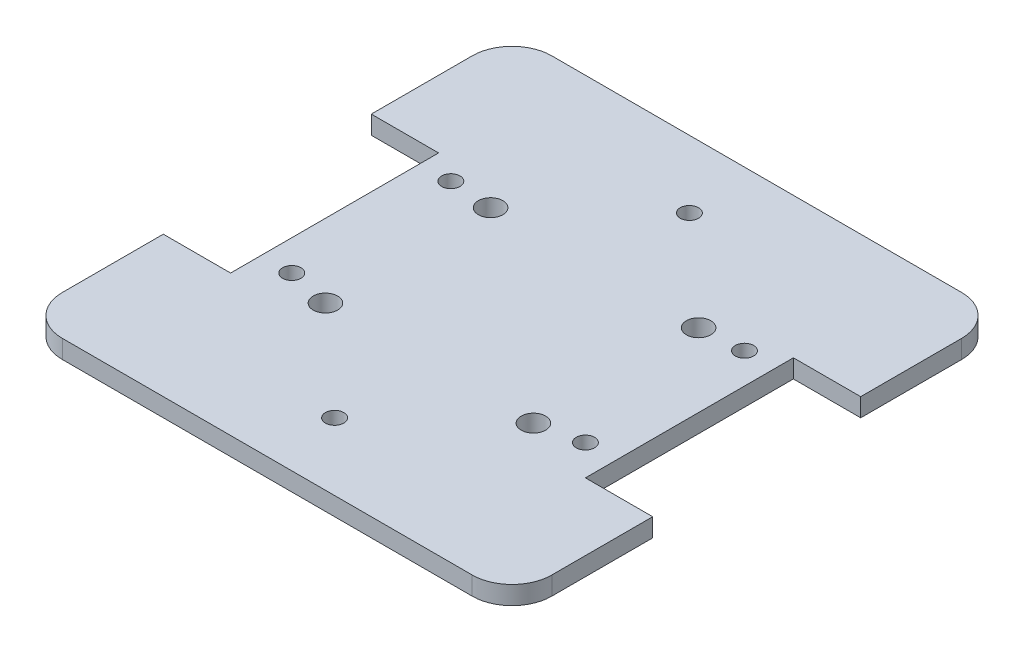
ISO-10303-21;
HEADER;
FILE_DESCRIPTION(('STEP AP214'),'2;1');
FILE_NAME('part.step','',(''),(''),'','','');
FILE_SCHEMA(('AUTOMOTIVE_DESIGN { 1 0 10303 214 1 1 1 1 }'));
ENDSEC;
DATA;
#1=APPLICATION_CONTEXT('core data for automotive mechanical design processes');
#2=APPLICATION_PROTOCOL_DEFINITION('international standard','automotive_design',2000,#1);
#3=PRODUCT_CONTEXT('',#1,'mechanical');
#4=PRODUCT('Part','Part','',(#3));
#5=PRODUCT_RELATED_PRODUCT_CATEGORY('part','',(#4));
#6=PRODUCT_DEFINITION_FORMATION('','',#4);
#7=PRODUCT_DEFINITION_CONTEXT('part definition',#1,'design');
#8=PRODUCT_DEFINITION('design','',#6,#7);
#9=PRODUCT_DEFINITION_SHAPE('','',#8);
#10=(LENGTH_UNIT() NAMED_UNIT(*) SI_UNIT(.MILLI.,.METRE.));
#11=(NAMED_UNIT(*) PLANE_ANGLE_UNIT() SI_UNIT($,.RADIAN.));
#12=(NAMED_UNIT(*) SI_UNIT($,.STERADIAN.) SOLID_ANGLE_UNIT());
#13=UNCERTAINTY_MEASURE_WITH_UNIT(LENGTH_MEASURE(1.E-05),#10,'distance_accuracy_value','');
#14=(GEOMETRIC_REPRESENTATION_CONTEXT(3) GLOBAL_UNCERTAINTY_ASSIGNED_CONTEXT((#13)) GLOBAL_UNIT_ASSIGNED_CONTEXT((#10,
#11,#12)) REPRESENTATION_CONTEXT('',''));
#15=CARTESIAN_POINT('',(0.,0.,0.));
#16=DIRECTION('',(0.,0.,1.));
#17=DIRECTION('',(1.,0.,0.));
#18=AXIS2_PLACEMENT_3D('',#15,#16,#17);
#19=CARTESIAN_POINT('',(6.5,3.,-6.5));
#20=DIRECTION('',(0.,-1.,0.));
#21=DIRECTION('',(0.,0.,-1.));
#22=AXIS2_PLACEMENT_3D('',#19,#20,#21);
#23=PLANE('',#22);
#24=CARTESIAN_POINT('',(6.5,3.,-6.5));
#25=DIRECTION('',(0.,1.,0.));
#26=DIRECTION('',(0.,0.,-1.));
#27=AXIS2_PLACEMENT_3D('',#24,#25,#26);
#28=CIRCLE('',#27,6.5);
#29=CARTESIAN_POINT('',(0.,3.,-6.50000000000005));
#30=VERTEX_POINT('',#29);
#31=CARTESIAN_POINT('',(6.50000000000005,3.,0.));
#32=VERTEX_POINT('',#31);
#33=EDGE_CURVE('E214',#30,#32,#28,.T.);
#34=ORIENTED_EDGE('',*,*,#33,.T.);
#35=DIRECTION('',(1.,0.,0.));
#36=VECTOR('',#35,1.);
#37=CARTESIAN_POINT('',(6.50000000000005,3.,0.));
#38=LINE('',#37,#36);
#39=CARTESIAN_POINT('',(73.5,3.,0.));
#40=VERTEX_POINT('',#39);
#41=EDGE_CURVE('E122',#32,#40,#38,.T.);
#42=ORIENTED_EDGE('',*,*,#41,.T.);
#43=CARTESIAN_POINT('',(73.5,3.,-6.5));
#44=DIRECTION('',(0.,1.,0.));
#45=DIRECTION('',(0.,0.,-1.));
#46=AXIS2_PLACEMENT_3D('',#43,#44,#45);
#47=CIRCLE('',#46,6.5);
#48=CARTESIAN_POINT('',(80.,3.,-6.50000000000005));
#49=VERTEX_POINT('',#48);
#50=EDGE_CURVE('E253',#40,#49,#47,.T.);
#51=ORIENTED_EDGE('',*,*,#50,.T.);
#52=DIRECTION('',(0.,0.,-1.));
#53=VECTOR('',#52,1.);
#54=CARTESIAN_POINT('',(80.,3.,-6.50000000000005));
#55=LINE('',#54,#53);
#56=CARTESIAN_POINT('',(80.,3.,-23.));
#57=VERTEX_POINT('',#56);
#58=EDGE_CURVE('E272',#49,#57,#55,.T.);
#59=ORIENTED_EDGE('',*,*,#58,.T.);
#60=DIRECTION('',(-1.,0.,0.));
#61=VECTOR('',#60,1.);
#62=CARTESIAN_POINT('',(69.,3.,-23.));
#63=LINE('',#62,#61);
#64=CARTESIAN_POINT('',(69.,3.,-23.));
#65=VERTEX_POINT('',#64);
#66=EDGE_CURVE('E269',#57,#65,#63,.T.);
#67=ORIENTED_EDGE('',*,*,#66,.T.);
#68=DIRECTION('',(0.,0.,-1.));
#69=VECTOR('',#68,1.);
#70=CARTESIAN_POINT('',(69.,3.,-23.));
#71=LINE('',#70,#69);
#72=CARTESIAN_POINT('',(69.,3.,-57.));
#73=VERTEX_POINT('',#72);
#74=EDGE_CURVE('E271',#65,#73,#71,.T.);
#75=ORIENTED_EDGE('',*,*,#74,.T.);
#76=DIRECTION('',(1.,0.,0.));
#77=VECTOR('',#76,1.);
#78=CARTESIAN_POINT('',(69.,3.,-57.));
#79=LINE('',#78,#77);
#80=CARTESIAN_POINT('',(80.,3.,-57.));
#81=VERTEX_POINT('',#80);
#82=EDGE_CURVE('E274',#73,#81,#79,.T.);
#83=ORIENTED_EDGE('',*,*,#82,.T.);
#84=DIRECTION('',(0.,0.,-1.));
#85=VECTOR('',#84,1.);
#86=CARTESIAN_POINT('',(80.,3.,-57.));
#87=LINE('',#86,#85);
#88=CARTESIAN_POINT('',(80.,3.,-73.5));
#89=VERTEX_POINT('',#88);
#90=EDGE_CURVE('E280',#81,#89,#87,.T.);
#91=ORIENTED_EDGE('',*,*,#90,.T.);
#92=CARTESIAN_POINT('',(73.5,3.,-73.5));
#93=DIRECTION('',(0.,1.,0.));
#94=DIRECTION('',(0.,0.,-1.));
#95=AXIS2_PLACEMENT_3D('',#92,#93,#94);
#96=CIRCLE('',#95,6.5);
#97=CARTESIAN_POINT('',(73.5,3.,-80.));
#98=VERTEX_POINT('',#97);
#99=EDGE_CURVE('E282',#89,#98,#96,.T.);
#100=ORIENTED_EDGE('',*,*,#99,.T.);
#101=DIRECTION('',(-1.,0.,0.));
#102=VECTOR('',#101,1.);
#103=CARTESIAN_POINT('',(73.5,3.,-80.));
#104=LINE('',#103,#102);
#105=CARTESIAN_POINT('',(6.50000000000005,3.,-80.));
#106=VERTEX_POINT('',#105);
#107=EDGE_CURVE('E284',#98,#106,#104,.T.);
#108=ORIENTED_EDGE('',*,*,#107,.T.);
#109=CARTESIAN_POINT('',(6.50000000000001,3.,-73.5));
#110=DIRECTION('',(0.,1.,0.));
#111=DIRECTION('',(0.,0.,1.));
#112=AXIS2_PLACEMENT_3D('',#109,#110,#111);
#113=CIRCLE('',#112,6.5);
#114=CARTESIAN_POINT('',(0.,3.,-73.4999999999999));
#115=VERTEX_POINT('',#114);
#116=EDGE_CURVE('E286',#106,#115,#113,.T.);
#117=ORIENTED_EDGE('',*,*,#116,.T.);
#118=DIRECTION('',(0.,0.,1.));
#119=VECTOR('',#118,1.);
#120=CARTESIAN_POINT('',(0.,3.,-73.4999999999999));
#121=LINE('',#120,#119);
#122=CARTESIAN_POINT('',(0.,3.,-57.));
#123=VERTEX_POINT('',#122);
#124=EDGE_CURVE('E288',#115,#123,#121,.T.);
#125=ORIENTED_EDGE('',*,*,#124,.T.);
#126=DIRECTION('',(1.,0.,0.));
#127=VECTOR('',#126,1.);
#128=CARTESIAN_POINT('',(11.,3.,-57.));
#129=LINE('',#128,#127);
#130=CARTESIAN_POINT('',(11.,3.,-57.));
#131=VERTEX_POINT('',#130);
#132=EDGE_CURVE('E165',#123,#131,#129,.T.);
#133=ORIENTED_EDGE('',*,*,#132,.T.);
#134=DIRECTION('',(0.,0.,1.));
#135=VECTOR('',#134,1.);
#136=CARTESIAN_POINT('',(11.,3.,-23.));
#137=LINE('',#136,#135);
#138=CARTESIAN_POINT('',(11.,3.,-23.));
#139=VERTEX_POINT('',#138);
#140=EDGE_CURVE('E159',#131,#139,#137,.T.);
#141=ORIENTED_EDGE('',*,*,#140,.T.);
#142=DIRECTION('',(-1.,0.,0.));
#143=VECTOR('',#142,1.);
#144=CARTESIAN_POINT('',(11.,3.,-23.));
#145=LINE('',#144,#143);
#146=CARTESIAN_POINT('',(0.,3.,-23.));
#147=VERTEX_POINT('',#146);
#148=EDGE_CURVE('E163',#139,#147,#145,.T.);
#149=ORIENTED_EDGE('',*,*,#148,.T.);
#150=DIRECTION('',(0.,0.,1.));
#151=VECTOR('',#150,1.);
#152=CARTESIAN_POINT('',(0.,3.,-23.));
#153=LINE('',#152,#151);
#154=EDGE_CURVE('E55',#147,#30,#153,.T.);
#155=ORIENTED_EDGE('',*,*,#154,.T.);
#156=EDGE_LOOP('',(#34,#42,#51,#59,#67,#75,#83,#91,#100,#108,#117,#125,#133,#141,#149,#155));
#157=FACE_BOUND('',#156,.T.);
#158=CARTESIAN_POINT('',(23.,3.,-53.5));
#159=DIRECTION('',(0.,1.,0.));
#160=DIRECTION('',(0.,0.,1.));
#161=AXIS2_PLACEMENT_3D('',#158,#159,#160);
#162=CIRCLE('',#161,2.);
#163=CARTESIAN_POINT('',(23.,3.,-51.5));
#164=VERTEX_POINT('',#163);
#165=EDGE_CURVE('E187',#164,#164,#162,.T.);
#166=ORIENTED_EDGE('',*,*,#165,.F.);
#167=EDGE_LOOP('',(#166));
#168=FACE_BOUND('',#167,.T.);
#169=CARTESIAN_POINT('',(23.,3.,-26.5));
#170=DIRECTION('',(0.,1.,0.));
#171=DIRECTION('',(0.,0.,1.));
#172=AXIS2_PLACEMENT_3D('',#169,#170,#171);
#173=CIRCLE('',#172,2.);
#174=CARTESIAN_POINT('',(23.,3.,-24.5));
#175=VERTEX_POINT('',#174);
#176=EDGE_CURVE('E412',#175,#175,#173,.T.);
#177=ORIENTED_EDGE('',*,*,#176,.F.);
#178=EDGE_LOOP('',(#177));
#179=FACE_BOUND('',#178,.T.);
#180=CARTESIAN_POINT('',(57.,3.,-26.5));
#181=DIRECTION('',(0.,1.,0.));
#182=DIRECTION('',(0.,0.,-1.));
#183=AXIS2_PLACEMENT_3D('',#180,#181,#182);
#184=CIRCLE('',#183,2.);
#185=CARTESIAN_POINT('',(57.,3.,-28.5));
#186=VERTEX_POINT('',#185);
#187=EDGE_CURVE('E406',#186,#186,#184,.T.);
#188=ORIENTED_EDGE('',*,*,#187,.F.);
#189=EDGE_LOOP('',(#188));
#190=FACE_BOUND('',#189,.T.);
#191=CARTESIAN_POINT('',(57.,3.,-53.5));
#192=DIRECTION('',(0.,1.,0.));
#193=DIRECTION('',(0.,0.,-1.));
#194=AXIS2_PLACEMENT_3D('',#191,#192,#193);
#195=CIRCLE('',#194,2.);
#196=CARTESIAN_POINT('',(57.,3.,-55.5));
#197=VERTEX_POINT('',#196);
#198=EDGE_CURVE('E400',#197,#197,#195,.T.);
#199=ORIENTED_EDGE('',*,*,#198,.F.);
#200=EDGE_LOOP('',(#199));
#201=FACE_BOUND('',#200,.T.);
#202=CARTESIAN_POINT('',(40.,3.,-69.));
#203=DIRECTION('',(0.,1.,0.));
#204=DIRECTION('',(0.,0.,1.));
#205=AXIS2_PLACEMENT_3D('',#202,#203,#204);
#206=CIRCLE('',#205,1.5);
#207=CARTESIAN_POINT('',(40.,3.,-67.5));
#208=VERTEX_POINT('',#207);
#209=EDGE_CURVE('E394',#208,#208,#206,.T.);
#210=ORIENTED_EDGE('',*,*,#209,.F.);
#211=EDGE_LOOP('',(#210));
#212=FACE_BOUND('',#211,.T.);
#213=CARTESIAN_POINT('',(40.,3.,-11.));
#214=DIRECTION('',(0.,1.,0.));
#215=DIRECTION('',(0.,0.,-1.));
#216=AXIS2_PLACEMENT_3D('',#213,#214,#215);
#217=CIRCLE('',#216,1.5);
#218=CARTESIAN_POINT('',(40.,3.,-12.5));
#219=VERTEX_POINT('',#218);
#220=EDGE_CURVE('E388',#219,#219,#217,.T.);
#221=ORIENTED_EDGE('',*,*,#220,.F.);
#222=EDGE_LOOP('',(#221));
#223=FACE_BOUND('',#222,.T.);
#224=CARTESIAN_POINT('',(16.,3.,-54.));
#225=DIRECTION('',(0.,1.,0.));
#226=DIRECTION('',(0.,0.,1.));
#227=AXIS2_PLACEMENT_3D('',#224,#225,#226);
#228=CIRCLE('',#227,1.5);
#229=CARTESIAN_POINT('',(16.,3.,-52.5));
#230=VERTEX_POINT('',#229);
#231=EDGE_CURVE('E382',#230,#230,#228,.T.);
#232=ORIENTED_EDGE('',*,*,#231,.F.);
#233=EDGE_LOOP('',(#232));
#234=FACE_BOUND('',#233,.T.);
#235=CARTESIAN_POINT('',(16.,3.,-28.));
#236=DIRECTION('',(0.,1.,0.));
#237=DIRECTION('',(0.,0.,1.));
#238=AXIS2_PLACEMENT_3D('',#235,#236,#237);
#239=CIRCLE('',#238,1.5);
#240=CARTESIAN_POINT('',(16.,3.,-26.5));
#241=VERTEX_POINT('',#240);
#242=EDGE_CURVE('E376',#241,#241,#239,.T.);
#243=ORIENTED_EDGE('',*,*,#242,.F.);
#244=EDGE_LOOP('',(#243));
#245=FACE_BOUND('',#244,.T.);
#246=CARTESIAN_POINT('',(64.,3.,-28.));
#247=DIRECTION('',(0.,1.,0.));
#248=DIRECTION('',(0.,0.,-1.));
#249=AXIS2_PLACEMENT_3D('',#246,#247,#248);
#250=CIRCLE('',#249,1.50000000000001);
#251=CARTESIAN_POINT('',(64.,3.,-29.5));
#252=VERTEX_POINT('',#251);
#253=EDGE_CURVE('E370',#252,#252,#250,.T.);
#254=ORIENTED_EDGE('',*,*,#253,.F.);
#255=EDGE_LOOP('',(#254));
#256=FACE_BOUND('',#255,.T.);
#257=CARTESIAN_POINT('',(64.,3.,-54.));
#258=DIRECTION('',(0.,1.,0.));
#259=DIRECTION('',(0.,0.,-1.));
#260=AXIS2_PLACEMENT_3D('',#257,#258,#259);
#261=CIRCLE('',#260,1.5);
#262=CARTESIAN_POINT('',(64.,3.,-55.5));
#263=VERTEX_POINT('',#262);
#264=EDGE_CURVE('E361',#263,#263,#261,.T.);
#265=ORIENTED_EDGE('',*,*,#264,.F.);
#266=EDGE_LOOP('',(#265));
#267=FACE_BOUND('',#266,.T.);
#268=ADVANCED_FACE('F38',(#157,#168,#179,#190,#201,#212,#223,#234,#245,#256,#267),#23,.F.);
#269=CARTESIAN_POINT('',(6.5,0.,-6.5));
#270=DIRECTION('',(0.,-1.,0.));
#271=DIRECTION('',(0.,0.,-1.));
#272=AXIS2_PLACEMENT_3D('',#269,#270,#271);
#273=PLANE('',#272);
#274=CARTESIAN_POINT('',(64.,0.,-28.));
#275=DIRECTION('',(0.,1.,0.));
#276=DIRECTION('',(0.,0.,-1.));
#277=AXIS2_PLACEMENT_3D('',#274,#275,#276);
#278=CIRCLE('',#277,1.50000000000001);
#279=CARTESIAN_POINT('',(64.,0.,-29.5));
#280=VERTEX_POINT('',#279);
#281=EDGE_CURVE('E367',#280,#280,#278,.T.);
#282=ORIENTED_EDGE('',*,*,#281,.T.);
#283=EDGE_LOOP('',(#282));
#284=FACE_BOUND('',#283,.T.);
#285=CARTESIAN_POINT('',(16.,0.,-54.));
#286=DIRECTION('',(0.,1.,0.));
#287=DIRECTION('',(0.,0.,1.));
#288=AXIS2_PLACEMENT_3D('',#285,#286,#287);
#289=CIRCLE('',#288,1.5);
#290=CARTESIAN_POINT('',(16.,0.,-52.5));
#291=VERTEX_POINT('',#290);
#292=EDGE_CURVE('E379',#291,#291,#289,.T.);
#293=ORIENTED_EDGE('',*,*,#292,.T.);
#294=EDGE_LOOP('',(#293));
#295=FACE_BOUND('',#294,.T.);
#296=CARTESIAN_POINT('',(40.,0.,-69.));
#297=DIRECTION('',(0.,1.,0.));
#298=DIRECTION('',(0.,0.,1.));
#299=AXIS2_PLACEMENT_3D('',#296,#297,#298);
#300=CIRCLE('',#299,1.5);
#301=CARTESIAN_POINT('',(40.,0.,-67.5));
#302=VERTEX_POINT('',#301);
#303=EDGE_CURVE('E391',#302,#302,#300,.T.);
#304=ORIENTED_EDGE('',*,*,#303,.T.);
#305=EDGE_LOOP('',(#304));
#306=FACE_BOUND('',#305,.T.);
#307=CARTESIAN_POINT('',(57.,0.,-26.5));
#308=DIRECTION('',(0.,1.,0.));
#309=DIRECTION('',(0.,0.,-1.));
#310=AXIS2_PLACEMENT_3D('',#307,#308,#309);
#311=CIRCLE('',#310,2.);
#312=CARTESIAN_POINT('',(57.,0.,-28.5));
#313=VERTEX_POINT('',#312);
#314=EDGE_CURVE('E403',#313,#313,#311,.T.);
#315=ORIENTED_EDGE('',*,*,#314,.T.);
#316=EDGE_LOOP('',(#315));
#317=FACE_BOUND('',#316,.T.);
#318=CARTESIAN_POINT('',(23.,0.,-53.5));
#319=DIRECTION('',(0.,1.,0.));
#320=DIRECTION('',(0.,0.,1.));
#321=AXIS2_PLACEMENT_3D('',#318,#319,#320);
#322=CIRCLE('',#321,2.);
#323=CARTESIAN_POINT('',(23.,0.,-51.5));
#324=VERTEX_POINT('',#323);
#325=EDGE_CURVE('E415',#324,#324,#322,.T.);
#326=ORIENTED_EDGE('',*,*,#325,.T.);
#327=EDGE_LOOP('',(#326));
#328=FACE_BOUND('',#327,.T.);
#329=CARTESIAN_POINT('',(6.5,0.,-6.5));
#330=DIRECTION('',(0.,1.,0.));
#331=DIRECTION('',(0.,0.,-1.));
#332=AXIS2_PLACEMENT_3D('',#329,#330,#331);
#333=CIRCLE('',#332,6.5);
#334=CARTESIAN_POINT('',(0.,0.,-6.50000000000005));
#335=VERTEX_POINT('',#334);
#336=CARTESIAN_POINT('',(6.50000000000005,0.,0.));
#337=VERTEX_POINT('',#336);
#338=EDGE_CURVE('E183',#335,#337,#333,.T.);
#339=ORIENTED_EDGE('',*,*,#338,.F.);
#340=DIRECTION('',(0.,0.,1.));
#341=VECTOR('',#340,1.);
#342=CARTESIAN_POINT('',(0.,0.,-23.));
#343=LINE('',#342,#341);
#344=CARTESIAN_POINT('',(0.,0.,-23.));
#345=VERTEX_POINT('',#344);
#346=EDGE_CURVE('E114',#345,#335,#343,.T.);
#347=ORIENTED_EDGE('',*,*,#346,.F.);
#348=DIRECTION('',(-1.,0.,0.));
#349=VECTOR('',#348,1.);
#350=CARTESIAN_POINT('',(11.,0.,-23.));
#351=LINE('',#350,#349);
#352=CARTESIAN_POINT('',(11.,0.,-23.));
#353=VERTEX_POINT('',#352);
#354=EDGE_CURVE('E108',#353,#345,#351,.T.);
#355=ORIENTED_EDGE('',*,*,#354,.F.);
#356=DIRECTION('',(0.,0.,1.));
#357=VECTOR('',#356,1.);
#358=CARTESIAN_POINT('',(11.,0.,-23.));
#359=LINE('',#358,#357);
#360=CARTESIAN_POINT('',(11.,0.,-57.));
#361=VERTEX_POINT('',#360);
#362=EDGE_CURVE('E173',#361,#353,#359,.T.);
#363=ORIENTED_EDGE('',*,*,#362,.F.);
#364=DIRECTION('',(1.,0.,0.));
#365=VECTOR('',#364,1.);
#366=CARTESIAN_POINT('',(11.,0.,-57.));
#367=LINE('',#366,#365);
#368=CARTESIAN_POINT('',(0.,0.,-57.));
#369=VERTEX_POINT('',#368);
#370=EDGE_CURVE('E209',#369,#361,#367,.T.);
#371=ORIENTED_EDGE('',*,*,#370,.F.);
#372=DIRECTION('',(0.,0.,1.));
#373=VECTOR('',#372,1.);
#374=CARTESIAN_POINT('',(0.,0.,-73.4999999999999));
#375=LINE('',#374,#373);
#376=CARTESIAN_POINT('',(0.,0.,-73.4999999999999));
#377=VERTEX_POINT('',#376);
#378=EDGE_CURVE('E207',#377,#369,#375,.T.);
#379=ORIENTED_EDGE('',*,*,#378,.F.);
#380=CARTESIAN_POINT('',(6.50000000000001,0.,-73.5));
#381=DIRECTION('',(0.,1.,0.));
#382=DIRECTION('',(0.,0.,1.));
#383=AXIS2_PLACEMENT_3D('',#380,#381,#382);
#384=CIRCLE('',#383,6.5);
#385=CARTESIAN_POINT('',(6.50000000000005,0.,-80.));
#386=VERTEX_POINT('',#385);
#387=EDGE_CURVE('E205',#386,#377,#384,.T.);
#388=ORIENTED_EDGE('',*,*,#387,.F.);
#389=DIRECTION('',(-1.,0.,0.));
#390=VECTOR('',#389,1.);
#391=CARTESIAN_POINT('',(73.5,0.,-80.));
#392=LINE('',#391,#390);
#393=CARTESIAN_POINT('',(73.5,0.,-80.));
#394=VERTEX_POINT('',#393);
#395=EDGE_CURVE('E203',#394,#386,#392,.T.);
#396=ORIENTED_EDGE('',*,*,#395,.F.);
#397=CARTESIAN_POINT('',(73.5,0.,-73.5));
#398=DIRECTION('',(0.,1.,0.));
#399=DIRECTION('',(0.,0.,-1.));
#400=AXIS2_PLACEMENT_3D('',#397,#398,#399);
#401=CIRCLE('',#400,6.5);
#402=CARTESIAN_POINT('',(80.,0.,-73.5));
#403=VERTEX_POINT('',#402);
#404=EDGE_CURVE('E201',#403,#394,#401,.T.);
#405=ORIENTED_EDGE('',*,*,#404,.F.);
#406=DIRECTION('',(0.,0.,-1.));
#407=VECTOR('',#406,1.);
#408=CARTESIAN_POINT('',(80.,0.,-57.));
#409=LINE('',#408,#407);
#410=CARTESIAN_POINT('',(80.,0.,-57.));
#411=VERTEX_POINT('',#410);
#412=EDGE_CURVE('E199',#411,#403,#409,.T.);
#413=ORIENTED_EDGE('',*,*,#412,.F.);
#414=DIRECTION('',(1.,0.,0.));
#415=VECTOR('',#414,1.);
#416=CARTESIAN_POINT('',(69.,0.,-57.));
#417=LINE('',#416,#415);
#418=CARTESIAN_POINT('',(69.,0.,-57.));
#419=VERTEX_POINT('',#418);
#420=EDGE_CURVE('E197',#419,#411,#417,.T.);
#421=ORIENTED_EDGE('',*,*,#420,.F.);
#422=DIRECTION('',(0.,0.,-1.));
#423=VECTOR('',#422,1.);
#424=CARTESIAN_POINT('',(69.,0.,-23.));
#425=LINE('',#424,#423);
#426=CARTESIAN_POINT('',(69.,0.,-23.));
#427=VERTEX_POINT('',#426);
#428=EDGE_CURVE('E195',#427,#419,#425,.T.);
#429=ORIENTED_EDGE('',*,*,#428,.F.);
#430=DIRECTION('',(-1.,0.,0.));
#431=VECTOR('',#430,1.);
#432=CARTESIAN_POINT('',(69.,0.,-23.));
#433=LINE('',#432,#431);
#434=CARTESIAN_POINT('',(80.,0.,-23.));
#435=VERTEX_POINT('',#434);
#436=EDGE_CURVE('E193',#435,#427,#433,.T.);
#437=ORIENTED_EDGE('',*,*,#436,.F.);
#438=DIRECTION('',(0.,0.,-1.));
#439=VECTOR('',#438,1.);
#440=CARTESIAN_POINT('',(80.,0.,-6.50000000000005));
#441=LINE('',#440,#439);
#442=CARTESIAN_POINT('',(80.,0.,-6.50000000000005));
#443=VERTEX_POINT('',#442);
#444=EDGE_CURVE('E191',#443,#435,#441,.T.);
#445=ORIENTED_EDGE('',*,*,#444,.F.);
#446=CARTESIAN_POINT('',(73.5,0.,-6.5));
#447=DIRECTION('',(0.,1.,0.));
#448=DIRECTION('',(0.,0.,-1.));
#449=AXIS2_PLACEMENT_3D('',#446,#447,#448);
#450=CIRCLE('',#449,6.5);
#451=CARTESIAN_POINT('',(73.5,0.,0.));
#452=VERTEX_POINT('',#451);
#453=EDGE_CURVE('E189',#452,#443,#450,.T.);
#454=ORIENTED_EDGE('',*,*,#453,.F.);
#455=DIRECTION('',(1.,0.,0.));
#456=VECTOR('',#455,1.);
#457=CARTESIAN_POINT('',(6.50000000000005,0.,0.));
#458=LINE('',#457,#456);
#459=EDGE_CURVE('E186',#337,#452,#458,.T.);
#460=ORIENTED_EDGE('',*,*,#459,.F.);
#461=EDGE_LOOP('',(#339,#347,#355,#363,#371,#379,#388,#396,#405,#413,#421,#429,#437,#445,#454,#460));
#462=FACE_BOUND('',#461,.T.);
#463=CARTESIAN_POINT('',(23.,0.,-26.5));
#464=DIRECTION('',(0.,1.,0.));
#465=DIRECTION('',(0.,0.,1.));
#466=AXIS2_PLACEMENT_3D('',#463,#464,#465);
#467=CIRCLE('',#466,2.);
#468=CARTESIAN_POINT('',(23.,0.,-24.5));
#469=VERTEX_POINT('',#468);
#470=EDGE_CURVE('E409',#469,#469,#467,.T.);
#471=ORIENTED_EDGE('',*,*,#470,.T.);
#472=EDGE_LOOP('',(#471));
#473=FACE_BOUND('',#472,.T.);
#474=CARTESIAN_POINT('',(57.,0.,-53.5));
#475=DIRECTION('',(0.,1.,0.));
#476=DIRECTION('',(0.,0.,-1.));
#477=AXIS2_PLACEMENT_3D('',#474,#475,#476);
#478=CIRCLE('',#477,2.);
#479=CARTESIAN_POINT('',(57.,0.,-55.5));
#480=VERTEX_POINT('',#479);
#481=EDGE_CURVE('E397',#480,#480,#478,.T.);
#482=ORIENTED_EDGE('',*,*,#481,.T.);
#483=EDGE_LOOP('',(#482));
#484=FACE_BOUND('',#483,.T.);
#485=CARTESIAN_POINT('',(40.,0.,-11.));
#486=DIRECTION('',(0.,1.,0.));
#487=DIRECTION('',(0.,0.,-1.));
#488=AXIS2_PLACEMENT_3D('',#485,#486,#487);
#489=CIRCLE('',#488,1.5);
#490=CARTESIAN_POINT('',(40.,0.,-12.5));
#491=VERTEX_POINT('',#490);
#492=EDGE_CURVE('E385',#491,#491,#489,.T.);
#493=ORIENTED_EDGE('',*,*,#492,.T.);
#494=EDGE_LOOP('',(#493));
#495=FACE_BOUND('',#494,.T.);
#496=CARTESIAN_POINT('',(16.,0.,-28.));
#497=DIRECTION('',(0.,1.,0.));
#498=DIRECTION('',(0.,0.,1.));
#499=AXIS2_PLACEMENT_3D('',#496,#497,#498);
#500=CIRCLE('',#499,1.5);
#501=CARTESIAN_POINT('',(16.,0.,-26.5));
#502=VERTEX_POINT('',#501);
#503=EDGE_CURVE('E373',#502,#502,#500,.T.);
#504=ORIENTED_EDGE('',*,*,#503,.T.);
#505=EDGE_LOOP('',(#504));
#506=FACE_BOUND('',#505,.T.);
#507=CARTESIAN_POINT('',(64.,0.,-54.));
#508=DIRECTION('',(0.,1.,0.));
#509=DIRECTION('',(0.,0.,-1.));
#510=AXIS2_PLACEMENT_3D('',#507,#508,#509);
#511=CIRCLE('',#510,1.5);
#512=CARTESIAN_POINT('',(64.,0.,-55.5));
#513=VERTEX_POINT('',#512);
#514=EDGE_CURVE('E364',#513,#513,#511,.T.);
#515=ORIENTED_EDGE('',*,*,#514,.T.);
#516=EDGE_LOOP('',(#515));
#517=FACE_BOUND('',#516,.T.);
#518=ADVANCED_FACE('F257',(#284,#295,#306,#317,#328,#462,#473,#484,#495,#506,#517),#273,.T.);
#519=CARTESIAN_POINT('',(6.5,3.,-6.5));
#520=DIRECTION('',(0.,-1.,0.));
#521=DIRECTION('',(0.,0.,-1.));
#522=AXIS2_PLACEMENT_3D('',#519,#520,#521);
#523=CYLINDRICAL_SURFACE('',#522,6.5);
#524=ORIENTED_EDGE('',*,*,#338,.T.);
#525=DIRECTION('',(0.,-1.,0.));
#526=VECTOR('',#525,1.);
#527=CARTESIAN_POINT('',(6.50000000000005,3.,0.));
#528=LINE('',#527,#526);
#529=EDGE_CURVE('E11',#32,#337,#528,.T.);
#530=ORIENTED_EDGE('',*,*,#529,.F.);
#531=ORIENTED_EDGE('',*,*,#33,.F.);
#532=DIRECTION('',(0.,-1.,0.));
#533=VECTOR('',#532,1.);
#534=CARTESIAN_POINT('',(0.,3.,-6.50000000000005));
#535=LINE('',#534,#533);
#536=EDGE_CURVE('E179',#30,#335,#535,.T.);
#537=ORIENTED_EDGE('',*,*,#536,.T.);
#538=EDGE_LOOP('',(#524,#530,#531,#537));
#539=FACE_BOUND('',#538,.T.);
#540=ADVANCED_FACE('F40',(#539),#523,.T.);
#541=CARTESIAN_POINT('',(6.50000000000005,3.,0.));
#542=DIRECTION('',(0.,0.,-1.));
#543=DIRECTION('',(-1.,0.,0.));
#544=AXIS2_PLACEMENT_3D('',#541,#542,#543);
#545=PLANE('',#544);
#546=ORIENTED_EDGE('',*,*,#459,.T.);
#547=DIRECTION('',(0.,-1.,0.));
#548=VECTOR('',#547,1.);
#549=CARTESIAN_POINT('',(73.5,3.,0.));
#550=LINE('',#549,#548);
#551=EDGE_CURVE('E47',#40,#452,#550,.T.);
#552=ORIENTED_EDGE('',*,*,#551,.F.);
#553=ORIENTED_EDGE('',*,*,#41,.F.);
#554=ORIENTED_EDGE('',*,*,#529,.T.);
#555=EDGE_LOOP('',(#546,#552,#553,#554));
#556=FACE_BOUND('',#555,.T.);
#557=ADVANCED_FACE('F621',(#556),#545,.F.);
#558=CARTESIAN_POINT('',(73.5,3.,-6.5));
#559=DIRECTION('',(0.,-1.,0.));
#560=DIRECTION('',(0.,0.,-1.));
#561=AXIS2_PLACEMENT_3D('',#558,#559,#560);
#562=CYLINDRICAL_SURFACE('',#561,6.5);
#563=ORIENTED_EDGE('',*,*,#453,.T.);
#564=DIRECTION('',(0.,-1.,0.));
#565=VECTOR('',#564,1.);
#566=CARTESIAN_POINT('',(80.,3.,-6.50000000000005));
#567=LINE('',#566,#565);
#568=EDGE_CURVE('E245',#49,#443,#567,.T.);
#569=ORIENTED_EDGE('',*,*,#568,.F.);
#570=ORIENTED_EDGE('',*,*,#50,.F.);
#571=ORIENTED_EDGE('',*,*,#551,.T.);
#572=EDGE_LOOP('',(#563,#569,#570,#571));
#573=FACE_BOUND('',#572,.T.);
#574=ADVANCED_FACE('F251',(#573),#562,.T.);
#575=CARTESIAN_POINT('',(80.,3.,-6.50000000000005));
#576=DIRECTION('',(-1.,0.,0.));
#577=DIRECTION('',(0.,0.,1.));
#578=AXIS2_PLACEMENT_3D('',#575,#576,#577);
#579=PLANE('',#578);
#580=ORIENTED_EDGE('',*,*,#444,.T.);
#581=DIRECTION('',(0.,-1.,0.));
#582=VECTOR('',#581,1.);
#583=CARTESIAN_POINT('',(80.,3.,-23.));
#584=LINE('',#583,#582);
#585=EDGE_CURVE('E242',#57,#435,#584,.T.);
#586=ORIENTED_EDGE('',*,*,#585,.F.);
#587=ORIENTED_EDGE('',*,*,#58,.F.);
#588=ORIENTED_EDGE('',*,*,#568,.T.);
#589=EDGE_LOOP('',(#580,#586,#587,#588));
#590=FACE_BOUND('',#589,.T.);
#591=ADVANCED_FACE('F263',(#590),#579,.F.);
#592=CARTESIAN_POINT('',(69.,3.,-23.));
#593=DIRECTION('',(0.,0.,1.));
#594=DIRECTION('',(1.,0.,0.));
#595=AXIS2_PLACEMENT_3D('',#592,#593,#594);
#596=PLANE('',#595);
#597=ORIENTED_EDGE('',*,*,#436,.T.);
#598=DIRECTION('',(0.,-1.,0.));
#599=VECTOR('',#598,1.);
#600=CARTESIAN_POINT('',(69.,3.,-23.));
#601=LINE('',#600,#599);
#602=EDGE_CURVE('E239',#65,#427,#601,.T.);
#603=ORIENTED_EDGE('',*,*,#602,.F.);
#604=ORIENTED_EDGE('',*,*,#66,.F.);
#605=ORIENTED_EDGE('',*,*,#585,.T.);
#606=EDGE_LOOP('',(#597,#603,#604,#605));
#607=FACE_BOUND('',#606,.T.);
#608=ADVANCED_FACE('F267',(#607),#596,.F.);
#609=CARTESIAN_POINT('',(69.,3.,-23.));
#610=DIRECTION('',(-1.,0.,0.));
#611=DIRECTION('',(0.,0.,1.));
#612=AXIS2_PLACEMENT_3D('',#609,#610,#611);
#613=PLANE('',#612);
#614=ORIENTED_EDGE('',*,*,#428,.T.);
#615=DIRECTION('',(0.,-1.,0.));
#616=VECTOR('',#615,1.);
#617=CARTESIAN_POINT('',(69.,3.,-57.));
#618=LINE('',#617,#616);
#619=EDGE_CURVE('E236',#73,#419,#618,.T.);
#620=ORIENTED_EDGE('',*,*,#619,.F.);
#621=ORIENTED_EDGE('',*,*,#74,.F.);
#622=ORIENTED_EDGE('',*,*,#602,.T.);
#623=EDGE_LOOP('',(#614,#620,#621,#622));
#624=FACE_BOUND('',#623,.T.);
#625=ADVANCED_FACE('F586',(#624),#613,.F.);
#626=CARTESIAN_POINT('',(69.,3.,-57.));
#627=DIRECTION('',(0.,0.,-1.));
#628=DIRECTION('',(-1.,0.,0.));
#629=AXIS2_PLACEMENT_3D('',#626,#627,#628);
#630=PLANE('',#629);
#631=ORIENTED_EDGE('',*,*,#420,.T.);
#632=DIRECTION('',(0.,-1.,0.));
#633=VECTOR('',#632,1.);
#634=CARTESIAN_POINT('',(80.,3.,-57.));
#635=LINE('',#634,#633);
#636=EDGE_CURVE('E233',#81,#411,#635,.T.);
#637=ORIENTED_EDGE('',*,*,#636,.F.);
#638=ORIENTED_EDGE('',*,*,#82,.F.);
#639=ORIENTED_EDGE('',*,*,#619,.T.);
#640=EDGE_LOOP('',(#631,#637,#638,#639));
#641=FACE_BOUND('',#640,.T.);
#642=ADVANCED_FACE('F576',(#641),#630,.F.);
#643=CARTESIAN_POINT('',(80.,3.,-57.));
#644=DIRECTION('',(-1.,0.,0.));
#645=DIRECTION('',(0.,0.,1.));
#646=AXIS2_PLACEMENT_3D('',#643,#644,#645);
#647=PLANE('',#646);
#648=ORIENTED_EDGE('',*,*,#412,.T.);
#649=DIRECTION('',(0.,-1.,0.));
#650=VECTOR('',#649,1.);
#651=CARTESIAN_POINT('',(80.,3.,-73.5));
#652=LINE('',#651,#650);
#653=EDGE_CURVE('E230',#89,#403,#652,.T.);
#654=ORIENTED_EDGE('',*,*,#653,.F.);
#655=ORIENTED_EDGE('',*,*,#90,.F.);
#656=ORIENTED_EDGE('',*,*,#636,.T.);
#657=EDGE_LOOP('',(#648,#654,#655,#656));
#658=FACE_BOUND('',#657,.T.);
#659=ADVANCED_FACE('F566',(#658),#647,.F.);
#660=CARTESIAN_POINT('',(73.5,3.,-73.5));
#661=DIRECTION('',(0.,-1.,0.));
#662=DIRECTION('',(0.,0.,-1.));
#663=AXIS2_PLACEMENT_3D('',#660,#661,#662);
#664=CYLINDRICAL_SURFACE('',#663,6.5);
#665=ORIENTED_EDGE('',*,*,#404,.T.);
#666=DIRECTION('',(0.,-1.,0.));
#667=VECTOR('',#666,1.);
#668=CARTESIAN_POINT('',(73.5,3.,-80.));
#669=LINE('',#668,#667);
#670=EDGE_CURVE('E227',#98,#394,#669,.T.);
#671=ORIENTED_EDGE('',*,*,#670,.F.);
#672=ORIENTED_EDGE('',*,*,#99,.F.);
#673=ORIENTED_EDGE('',*,*,#653,.T.);
#674=EDGE_LOOP('',(#665,#671,#672,#673));
#675=FACE_BOUND('',#674,.T.);
#676=ADVANCED_FACE('F556',(#675),#664,.T.);
#677=CARTESIAN_POINT('',(73.5,3.,-80.));
#678=DIRECTION('',(0.,0.,1.));
#679=DIRECTION('',(1.,0.,0.));
#680=AXIS2_PLACEMENT_3D('',#677,#678,#679);
#681=PLANE('',#680);
#682=ORIENTED_EDGE('',*,*,#395,.T.);
#683=DIRECTION('',(0.,-1.,0.));
#684=VECTOR('',#683,1.);
#685=CARTESIAN_POINT('',(6.50000000000005,3.,-80.));
#686=LINE('',#685,#684);
#687=EDGE_CURVE('E224',#106,#386,#686,.T.);
#688=ORIENTED_EDGE('',*,*,#687,.F.);
#689=ORIENTED_EDGE('',*,*,#107,.F.);
#690=ORIENTED_EDGE('',*,*,#670,.T.);
#691=EDGE_LOOP('',(#682,#688,#689,#690));
#692=FACE_BOUND('',#691,.T.);
#693=ADVANCED_FACE('F546',(#692),#681,.F.);
#694=CARTESIAN_POINT('',(6.50000000000001,3.,-73.5));
#695=DIRECTION('',(0.,-1.,0.));
#696=DIRECTION('',(0.,0.,-1.));
#697=AXIS2_PLACEMENT_3D('',#694,#695,#696);
#698=CYLINDRICAL_SURFACE('',#697,6.5);
#699=ORIENTED_EDGE('',*,*,#387,.T.);
#700=DIRECTION('',(0.,-1.,0.));
#701=VECTOR('',#700,1.);
#702=CARTESIAN_POINT('',(0.,3.,-73.4999999999999));
#703=LINE('',#702,#701);
#704=EDGE_CURVE('E221',#115,#377,#703,.T.);
#705=ORIENTED_EDGE('',*,*,#704,.F.);
#706=ORIENTED_EDGE('',*,*,#116,.F.);
#707=ORIENTED_EDGE('',*,*,#687,.T.);
#708=EDGE_LOOP('',(#699,#705,#706,#707));
#709=FACE_BOUND('',#708,.T.);
#710=ADVANCED_FACE('F537',(#709),#698,.T.);
#711=CARTESIAN_POINT('',(0.,3.,-73.4999999999999));
#712=DIRECTION('',(1.,0.,0.));
#713=DIRECTION('',(0.,0.,-1.));
#714=AXIS2_PLACEMENT_3D('',#711,#712,#713);
#715=PLANE('',#714);
#716=ORIENTED_EDGE('',*,*,#378,.T.);
#717=DIRECTION('',(0.,-1.,0.));
#718=VECTOR('',#717,1.);
#719=CARTESIAN_POINT('',(0.,3.,-57.));
#720=LINE('',#719,#718);
#721=EDGE_CURVE('E218',#123,#369,#720,.T.);
#722=ORIENTED_EDGE('',*,*,#721,.F.);
#723=ORIENTED_EDGE('',*,*,#124,.F.);
#724=ORIENTED_EDGE('',*,*,#704,.T.);
#725=EDGE_LOOP('',(#716,#722,#723,#724));
#726=FACE_BOUND('',#725,.T.);
#727=ADVANCED_FACE('F294',(#726),#715,.F.);
#728=CARTESIAN_POINT('',(11.,3.,-57.));
#729=DIRECTION('',(0.,0.,-1.));
#730=DIRECTION('',(-1.,0.,0.));
#731=AXIS2_PLACEMENT_3D('',#728,#729,#730);
#732=PLANE('',#731);
#733=ORIENTED_EDGE('',*,*,#370,.T.);
#734=DIRECTION('',(0.,-1.,0.));
#735=VECTOR('',#734,1.);
#736=CARTESIAN_POINT('',(11.,3.,-57.));
#737=LINE('',#736,#735);
#738=EDGE_CURVE('E174',#131,#361,#737,.T.);
#739=ORIENTED_EDGE('',*,*,#738,.F.);
#740=ORIENTED_EDGE('',*,*,#132,.F.);
#741=ORIENTED_EDGE('',*,*,#721,.T.);
#742=EDGE_LOOP('',(#733,#739,#740,#741));
#743=FACE_BOUND('',#742,.T.);
#744=ADVANCED_FACE('F298',(#743),#732,.F.);
#745=CARTESIAN_POINT('',(11.,3.,-23.));
#746=DIRECTION('',(1.,0.,0.));
#747=DIRECTION('',(0.,0.,-1.));
#748=AXIS2_PLACEMENT_3D('',#745,#746,#747);
#749=PLANE('',#748);
#750=ORIENTED_EDGE('',*,*,#362,.T.);
#751=DIRECTION('',(0.,-1.,0.));
#752=VECTOR('',#751,1.);
#753=CARTESIAN_POINT('',(11.,3.,-23.));
#754=LINE('',#753,#752);
#755=EDGE_CURVE('E170',#139,#353,#754,.T.);
#756=ORIENTED_EDGE('',*,*,#755,.F.);
#757=ORIENTED_EDGE('',*,*,#140,.F.);
#758=ORIENTED_EDGE('',*,*,#738,.T.);
#759=EDGE_LOOP('',(#750,#756,#757,#758));
#760=FACE_BOUND('',#759,.T.);
#761=ADVANCED_FACE('F171',(#760),#749,.F.);
#762=CARTESIAN_POINT('',(11.,3.,-23.));
#763=DIRECTION('',(0.,0.,1.));
#764=DIRECTION('',(1.,0.,0.));
#765=AXIS2_PLACEMENT_3D('',#762,#763,#764);
#766=PLANE('',#765);
#767=ORIENTED_EDGE('',*,*,#354,.T.);
#768=DIRECTION('',(0.,-1.,0.));
#769=VECTOR('',#768,1.);
#770=CARTESIAN_POINT('',(0.,3.,-23.));
#771=LINE('',#770,#769);
#772=EDGE_CURVE('E175',#147,#345,#771,.T.);
#773=ORIENTED_EDGE('',*,*,#772,.F.);
#774=ORIENTED_EDGE('',*,*,#148,.F.);
#775=ORIENTED_EDGE('',*,*,#755,.T.);
#776=EDGE_LOOP('',(#767,#773,#774,#775));
#777=FACE_BOUND('',#776,.T.);
#778=ADVANCED_FACE('F177',(#777),#766,.F.);
#779=CARTESIAN_POINT('',(0.,3.,-23.));
#780=DIRECTION('',(1.,0.,0.));
#781=DIRECTION('',(0.,0.,-1.));
#782=AXIS2_PLACEMENT_3D('',#779,#780,#781);
#783=PLANE('',#782);
#784=ORIENTED_EDGE('',*,*,#346,.T.);
#785=ORIENTED_EDGE('',*,*,#536,.F.);
#786=ORIENTED_EDGE('',*,*,#154,.F.);
#787=ORIENTED_EDGE('',*,*,#772,.T.);
#788=EDGE_LOOP('',(#784,#785,#786,#787));
#789=FACE_BOUND('',#788,.T.);
#790=ADVANCED_FACE('F302',(#789),#783,.F.);
#791=CARTESIAN_POINT('',(23.,3.,-53.5));
#792=DIRECTION('',(0.,-1.,0.));
#793=DIRECTION('',(0.,0.,-1.));
#794=AXIS2_PLACEMENT_3D('',#791,#792,#793);
#795=CYLINDRICAL_SURFACE('',#794,2.);
#796=ORIENTED_EDGE('',*,*,#165,.T.);
#797=EDGE_LOOP('',(#796));
#798=FACE_BOUND('',#797,.T.);
#799=ORIENTED_EDGE('',*,*,#325,.F.);
#800=EDGE_LOOP('',(#799));
#801=FACE_BOUND('',#800,.T.);
#802=ADVANCED_FACE('F304',(#798,#801),#795,.F.);
#803=CARTESIAN_POINT('',(23.,3.,-26.5));
#804=DIRECTION('',(0.,-1.,0.));
#805=DIRECTION('',(0.,0.,-1.));
#806=AXIS2_PLACEMENT_3D('',#803,#804,#805);
#807=CYLINDRICAL_SURFACE('',#806,2.);
#808=ORIENTED_EDGE('',*,*,#176,.T.);
#809=EDGE_LOOP('',(#808));
#810=FACE_BOUND('',#809,.T.);
#811=ORIENTED_EDGE('',*,*,#470,.F.);
#812=EDGE_LOOP('',(#811));
#813=FACE_BOUND('',#812,.T.);
#814=ADVANCED_FACE('F310',(#810,#813),#807,.F.);
#815=CARTESIAN_POINT('',(57.,3.,-26.5));
#816=DIRECTION('',(0.,-1.,0.));
#817=DIRECTION('',(0.,0.,-1.));
#818=AXIS2_PLACEMENT_3D('',#815,#816,#817);
#819=CYLINDRICAL_SURFACE('',#818,2.);
#820=ORIENTED_EDGE('',*,*,#187,.T.);
#821=EDGE_LOOP('',(#820));
#822=FACE_BOUND('',#821,.T.);
#823=ORIENTED_EDGE('',*,*,#314,.F.);
#824=EDGE_LOOP('',(#823));
#825=FACE_BOUND('',#824,.T.);
#826=ADVANCED_FACE('F324',(#822,#825),#819,.F.);
#827=CARTESIAN_POINT('',(57.,3.,-53.5));
#828=DIRECTION('',(0.,-1.,0.));
#829=DIRECTION('',(0.,0.,-1.));
#830=AXIS2_PLACEMENT_3D('',#827,#828,#829);
#831=CYLINDRICAL_SURFACE('',#830,2.);
#832=ORIENTED_EDGE('',*,*,#198,.T.);
#833=EDGE_LOOP('',(#832));
#834=FACE_BOUND('',#833,.T.);
#835=ORIENTED_EDGE('',*,*,#481,.F.);
#836=EDGE_LOOP('',(#835));
#837=FACE_BOUND('',#836,.T.);
#838=ADVANCED_FACE('F328',(#834,#837),#831,.F.);
#839=CARTESIAN_POINT('',(40.,3.,-69.));
#840=DIRECTION('',(0.,-1.,0.));
#841=DIRECTION('',(0.,0.,-1.));
#842=AXIS2_PLACEMENT_3D('',#839,#840,#841);
#843=CYLINDRICAL_SURFACE('',#842,1.5);
#844=ORIENTED_EDGE('',*,*,#209,.T.);
#845=EDGE_LOOP('',(#844));
#846=FACE_BOUND('',#845,.T.);
#847=ORIENTED_EDGE('',*,*,#303,.F.);
#848=EDGE_LOOP('',(#847));
#849=FACE_BOUND('',#848,.T.);
#850=ADVANCED_FACE('F332',(#846,#849),#843,.F.);
#851=CARTESIAN_POINT('',(40.,3.,-11.));
#852=DIRECTION('',(0.,-1.,0.));
#853=DIRECTION('',(0.,0.,-1.));
#854=AXIS2_PLACEMENT_3D('',#851,#852,#853);
#855=CYLINDRICAL_SURFACE('',#854,1.5);
#856=ORIENTED_EDGE('',*,*,#220,.T.);
#857=EDGE_LOOP('',(#856));
#858=FACE_BOUND('',#857,.T.);
#859=ORIENTED_EDGE('',*,*,#492,.F.);
#860=EDGE_LOOP('',(#859));
#861=FACE_BOUND('',#860,.T.);
#862=ADVANCED_FACE('F336',(#858,#861),#855,.F.);
#863=CARTESIAN_POINT('',(16.,3.,-54.));
#864=DIRECTION('',(0.,-1.,0.));
#865=DIRECTION('',(0.,0.,-1.));
#866=AXIS2_PLACEMENT_3D('',#863,#864,#865);
#867=CYLINDRICAL_SURFACE('',#866,1.5);
#868=ORIENTED_EDGE('',*,*,#231,.T.);
#869=EDGE_LOOP('',(#868));
#870=FACE_BOUND('',#869,.T.);
#871=ORIENTED_EDGE('',*,*,#292,.F.);
#872=EDGE_LOOP('',(#871));
#873=FACE_BOUND('',#872,.T.);
#874=ADVANCED_FACE('F340',(#870,#873),#867,.F.);
#875=CARTESIAN_POINT('',(16.,3.,-28.));
#876=DIRECTION('',(0.,-1.,0.));
#877=DIRECTION('',(0.,0.,-1.));
#878=AXIS2_PLACEMENT_3D('',#875,#876,#877);
#879=CYLINDRICAL_SURFACE('',#878,1.5);
#880=ORIENTED_EDGE('',*,*,#242,.T.);
#881=EDGE_LOOP('',(#880));
#882=FACE_BOUND('',#881,.T.);
#883=ORIENTED_EDGE('',*,*,#503,.F.);
#884=EDGE_LOOP('',(#883));
#885=FACE_BOUND('',#884,.T.);
#886=ADVANCED_FACE('F344',(#882,#885),#879,.F.);
#887=CARTESIAN_POINT('',(64.,3.,-28.));
#888=DIRECTION('',(0.,-1.,0.));
#889=DIRECTION('',(0.,0.,-1.));
#890=AXIS2_PLACEMENT_3D('',#887,#888,#889);
#891=CYLINDRICAL_SURFACE('',#890,1.50000000000001);
#892=ORIENTED_EDGE('',*,*,#253,.T.);
#893=EDGE_LOOP('',(#892));
#894=FACE_BOUND('',#893,.T.);
#895=ORIENTED_EDGE('',*,*,#281,.F.);
#896=EDGE_LOOP('',(#895));
#897=FACE_BOUND('',#896,.T.);
#898=ADVANCED_FACE('F348',(#894,#897),#891,.F.);
#899=CARTESIAN_POINT('',(64.,3.,-54.));
#900=DIRECTION('',(0.,-1.,0.));
#901=DIRECTION('',(0.,0.,-1.));
#902=AXIS2_PLACEMENT_3D('',#899,#900,#901);
#903=CYLINDRICAL_SURFACE('',#902,1.5);
#904=ORIENTED_EDGE('',*,*,#264,.T.);
#905=EDGE_LOOP('',(#904));
#906=FACE_BOUND('',#905,.T.);
#907=ORIENTED_EDGE('',*,*,#514,.F.);
#908=EDGE_LOOP('',(#907));
#909=FACE_BOUND('',#908,.T.);
#910=ADVANCED_FACE('F352',(#906,#909),#903,.F.);
#911=CLOSED_SHELL('',(#268,#518,#540,#557,#574,#591,#608,#625,#642,#659,#676,#693,#710,#727,
#744,#761,#778,#790,#802,#814,#826,#838,#850,#862,#874,#886,#898,#910));
#912=MANIFOLD_SOLID_BREP('B2',#911);
#913=ADVANCED_BREP_SHAPE_REPRESENTATION('',(#18,#912),#14);
#914=SHAPE_DEFINITION_REPRESENTATION(#9,#913);
ENDSEC;
END-ISO-10303-21;
